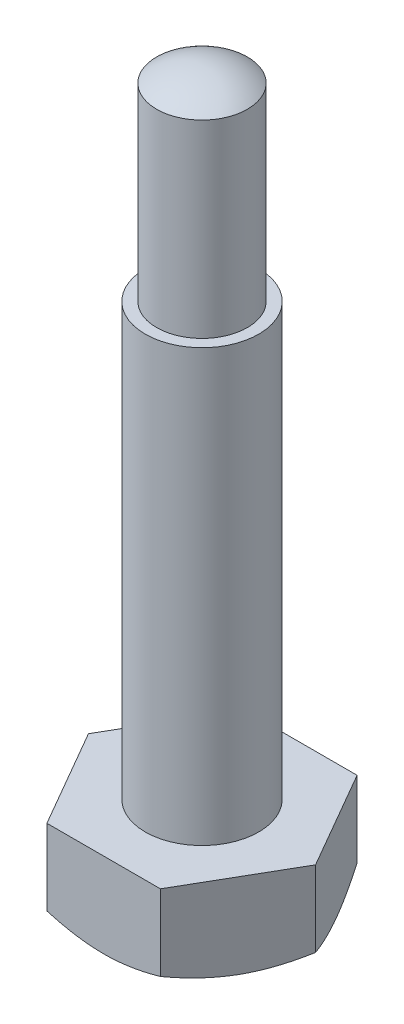
ISO-10303-21;
HEADER;
FILE_DESCRIPTION(('STEP AP214'),'2;1');
FILE_NAME('part.step','',(''),(''),'','','');
FILE_SCHEMA(('AUTOMOTIVE_DESIGN { 1 0 10303 214 1 1 1 1 }'));
ENDSEC;
DATA;
#1=APPLICATION_CONTEXT('core data for automotive mechanical design processes');
#2=APPLICATION_PROTOCOL_DEFINITION('international standard','automotive_design',2000,#1);
#3=PRODUCT_CONTEXT('',#1,'mechanical');
#4=PRODUCT('Part','Part','',(#3));
#5=PRODUCT_RELATED_PRODUCT_CATEGORY('part','',(#4));
#6=PRODUCT_DEFINITION_FORMATION('','',#4);
#7=PRODUCT_DEFINITION_CONTEXT('part definition',#1,'design');
#8=PRODUCT_DEFINITION('design','',#6,#7);
#9=PRODUCT_DEFINITION_SHAPE('','',#8);
#10=(LENGTH_UNIT() NAMED_UNIT(*) SI_UNIT(.MILLI.,.METRE.));
#11=(NAMED_UNIT(*) PLANE_ANGLE_UNIT() SI_UNIT($,.RADIAN.));
#12=(NAMED_UNIT(*) SI_UNIT($,.STERADIAN.) SOLID_ANGLE_UNIT());
#13=UNCERTAINTY_MEASURE_WITH_UNIT(LENGTH_MEASURE(1.E-05),#10,'distance_accuracy_value','');
#14=(GEOMETRIC_REPRESENTATION_CONTEXT(3) GLOBAL_UNCERTAINTY_ASSIGNED_CONTEXT((#13)) GLOBAL_UNIT_ASSIGNED_CONTEXT((#10,
#11,#12)) REPRESENTATION_CONTEXT('',''));
#15=CARTESIAN_POINT('',(0.,0.,0.));
#16=DIRECTION('',(0.,0.,1.));
#17=DIRECTION('',(1.,0.,0.));
#18=AXIS2_PLACEMENT_3D('',#15,#16,#17);
#19=CARTESIAN_POINT('',(0.,11.2,13.));
#20=DIRECTION('',(0.,0.,-1.));
#21=DIRECTION('',(-1.,0.,0.));
#22=AXIS2_PLACEMENT_3D('',#19,#20,#21);
#23=PLANE('',#22);
#24=CARTESIAN_POINT('',(26.2346972319166,9.3986800812125,13.));
#25=CARTESIAN_POINT('',(25.6258317751008,9.08374247217802,13.));
#26=CARTESIAN_POINT('',(25.0161104735973,8.77044554144086,13.));
#27=CARTESIAN_POINT('',(23.7945436675936,8.14795292384969,13.));
#28=CARTESIAN_POINT('',(23.1826980665779,7.83875742650056,13.));
#29=CARTESIAN_POINT('',(21.9555651962096,7.22483596554835,13.));
#30=CARTESIAN_POINT('',(21.3402740355332,6.92011776710691,13.));
#31=CARTESIAN_POINT('',(20.1067074220938,6.31679741810659,13.));
#32=CARTESIAN_POINT('',(19.4884320149866,6.01819517434446,13.));
#33=CARTESIAN_POINT('',(18.2148837083458,5.41270761526849,13.));
#34=CARTESIAN_POINT('',(17.559410879885,5.10624174421809,13.));
#35=CARTESIAN_POINT('',(16.2435075153828,4.50403283212745,13.));
#36=CARTESIAN_POINT('',(15.5830767817866,4.20829022113787,13.));
#37=CARTESIAN_POINT('',(14.2565046947777,3.63084437411776,13.));
#38=CARTESIAN_POINT('',(13.5903665939662,3.34913369373708,13.));
#39=CARTESIAN_POINT('',(12.2506953180829,2.80388367527136,13.));
#40=CARTESIAN_POINT('',(11.5771628598503,2.5403425934721,13.));
#41=CARTESIAN_POINT('',(10.5102407868527,2.14460554030767,13.));
#42=CARTESIAN_POINT('',(10.1198526207187,2.0043185803092,13.));
#43=CARTESIAN_POINT('',(9.335837761596,1.73312003778232,13.));
#44=CARTESIAN_POINT('',(8.94221121750567,1.60220802685639,13.));
#45=CARTESIAN_POINT('',(8.15136984112346,1.3513773216687,13.));
#46=CARTESIAN_POINT('',(7.7541543211264,1.23146078558955,13.));
#47=CARTESIAN_POINT('',(6.95602668561908,1.00455202576347,13.));
#48=CARTESIAN_POINT('',(6.55511457633311,0.897559780258935,13.));
#49=CARTESIAN_POINT('',(5.757501835472,0.700572312445905,13.));
#50=CARTESIAN_POINT('',(5.36087424149042,0.610283315624179,13.));
#51=CARTESIAN_POINT('',(4.56421970104771,0.446253048818399,13.));
#52=CARTESIAN_POINT('',(4.16419305539797,0.372510330020234,13.));
#53=CARTESIAN_POINT('',(3.36130815701185,0.243636304753637,13.));
#54=CARTESIAN_POINT('',(2.95845125293895,0.188496676239387,13.));
#55=CARTESIAN_POINT('',(2.15045576393463,0.0985545026967101,13.));
#56=CARTESIAN_POINT('',(1.74531721184881,0.0637516656603306,13.));
#57=CARTESIAN_POINT('',(0.927649753434319,0.0153668402761572,13.));
#58=CARTESIAN_POINT('',(0.515101254063948,0.0021114902553064,13.));
#59=CARTESIAN_POINT('',(-0.310099847625245,-0.00164489216117036,13.));
#60=CARTESIAN_POINT('',(-0.722752449914187,0.00785406891976774,13.));
#61=CARTESIAN_POINT('',(-1.54701663958637,0.0492378028315964,13.));
#62=CARTESIAN_POINT('',(-1.9586279623965,0.0811277840378777,13.));
#63=CARTESIAN_POINT('',(-2.77964125800397,0.166109329909629,13.));
#64=CARTESIAN_POINT('',(-3.18904317446393,0.219201432640728,13.));
#65=CARTESIAN_POINT('',(-4.01323522457472,0.346091941955446,13.));
#66=CARTESIAN_POINT('',(-4.4279625577467,0.420294471389162,13.));
#67=CARTESIAN_POINT('',(-5.25380371535489,0.586677879290008,13.));
#68=CARTESIAN_POINT('',(-5.66491717954556,0.678860529319952,13.));
#69=CARTESIAN_POINT('',(-6.48338602274355,0.878891520601452,13.));
#70=CARTESIAN_POINT('',(-6.89074051884319,0.986743447419311,13.));
#71=CARTESIAN_POINT('',(-7.70163246468095,1.2158780795427,13.));
#72=CARTESIAN_POINT('',(-8.10516989805223,1.33716084240877,13.));
#73=CARTESIAN_POINT('',(-8.90486242037007,1.58997054995961,13.));
#74=CARTESIAN_POINT('',(-9.30105125828483,1.72139129082436,13.));
#75=CARTESIAN_POINT('',(-10.0901480541392,1.99376322336739,13.));
#76=CARTESIAN_POINT('',(-10.4830558479608,2.13471488861274,13.));
#77=CARTESIAN_POINT('',(-11.2659590148391,2.42473122485754,13.));
#78=CARTESIAN_POINT('',(-11.6559536940584,2.57379776270564,13.));
#79=CARTESIAN_POINT('',(-12.4332352931876,2.8787950184023,13.));
#80=CARTESIAN_POINT('',(-12.8205222554015,3.03472562873117,13.));
#81=CARTESIAN_POINT('',(-13.5931545914344,3.35262778753084,13.));
#82=CARTESIAN_POINT('',(-13.9784970318592,3.51460645074058,13.));
#83=CARTESIAN_POINT('',(-14.7470362381397,3.84358293063094,13.));
#84=CARTESIAN_POINT('',(-15.130232967498,4.01058083238058,13.));
#85=CARTESIAN_POINT('',(-16.2768659575779,4.5179584348421,13.));
#86=CARTESIAN_POINT('',(-17.0374580657907,4.86476905141585,13.));
#87=CARTESIAN_POINT('',(-18.5077490092345,5.55023237852385,13.));
#88=CARTESIAN_POINT('',(-19.2177925562664,5.88815043389156,13.));
#89=CARTESIAN_POINT('',(-20.6336549677888,6.57277604213723,13.));
#90=CARTESIAN_POINT('',(-21.3394736760142,6.91948391767369,13.));
#91=CARTESIAN_POINT('',(-22.7451336195832,7.61853539897665,13.));
#92=CARTESIAN_POINT('',(-23.4449872328768,7.9708541637839,13.));
#93=CARTESIAN_POINT('',(-24.4926435776391,8.50342609438738,13.));
#94=CARTESIAN_POINT('',(-24.8414932478439,8.68162454333535,13.));
#95=CARTESIAN_POINT('',(-25.5385562813888,9.03925785937535,13.));
#96=CARTESIAN_POINT('',(-25.8867696476852,9.21869272070419,13.));
#97=CARTESIAN_POINT('',(-26.2346972319166,9.3986800812125,13.));
#98=B_SPLINE_CURVE_WITH_KNOTS('',3,(#24,#25,#26,#27,#28,#29,#30,#31,#32,#33,#34,#35,#36,#37,#38,
#39,#40,#41,#42,#43,#44,#45,#46,#47,#48,#49,#50,#51,#52,#53,#54,#55,#56,#57,#58,#59,#60,#61,#62,
#63,#64,#65,#66,#67,#68,#69,#70,#71,#72,#73,#74,#75,#76,#77,#78,#79,#80,#81,#82,#83,#84,#85,#86,
#87,#88,#89,#90,#91,#92,#93,#94,#95,#96,#97),.UNSPECIFIED.,.F.,.F.,(4,2,2,2,2,2,2,2,2,2,2,2,2,2,
2,2,2,2,2,2,2,2,2,2,2,2,2,2,2,2,2,2,2,2,2,2,4),(0.,2.05649083191151,4.11307635438399,
6.17288536924348,8.23266297053192,10.4033245771713,12.574073140971,14.7436575174168,
16.9130333908285,18.1574262247546,19.4017621585928,20.6463418091581,21.8909193644867,
23.1109343483001,24.3308424642549,25.5502041315244,26.7695482900314,28.0072097164768,
29.244870788097,30.4828198474871,31.7208003254393,32.9842900972413,34.2479044223365,
35.5118083542855,36.7757177031579,38.0278278991929,39.2800003551384,40.5324621042519,
41.7849042416221,43.0388692437525,44.2928555108206,46.8004608372656,49.1594516715557,
51.5185292259009,53.8690969916694,55.0442788403431,56.2194552149303),.UNSPECIFIED.);
#99=CARTESIAN_POINT('',(7.50555349946513,1.16111316720153,13.));
#100=VERTEX_POINT('',#99);
#101=CARTESIAN_POINT('',(0.,0.,13.));
#102=VERTEX_POINT('',#101);
#103=EDGE_CURVE('E319',#100,#102,#98,.T.);
#104=ORIENTED_EDGE('',*,*,#103,.F.);
#105=DIRECTION('',(0.,-1.,0.));
#106=VECTOR('',#105,1.);
#107=CARTESIAN_POINT('',(7.50555349946513,11.2,13.));
#108=LINE('',#107,#106);
#109=CARTESIAN_POINT('',(7.50555349946513,11.2,13.));
#110=VERTEX_POINT('',#109);
#111=EDGE_CURVE('E260',#110,#100,#108,.T.);
#112=ORIENTED_EDGE('',*,*,#111,.F.);
#113=DIRECTION('',(1.,0.,0.));
#114=VECTOR('',#113,1.);
#115=CARTESIAN_POINT('',(0.,11.2,13.));
#116=LINE('',#115,#114);
#117=CARTESIAN_POINT('',(-7.50555349946514,11.2,13.));
#118=VERTEX_POINT('',#117);
#119=EDGE_CURVE('E290',#118,#110,#116,.T.);
#120=ORIENTED_EDGE('',*,*,#119,.F.);
#121=DIRECTION('',(0.,-1.,0.));
#122=VECTOR('',#121,1.);
#123=CARTESIAN_POINT('',(-7.50555349946514,11.2,13.));
#124=LINE('',#123,#122);
#125=CARTESIAN_POINT('',(-7.50555349946514,1.16111316720153,13.));
#126=VERTEX_POINT('',#125);
#127=EDGE_CURVE('E272',#118,#126,#124,.T.);
#128=ORIENTED_EDGE('',*,*,#127,.T.);
#129=EDGE_CURVE('E196',#102,#126,#98,.T.);
#130=ORIENTED_EDGE('',*,*,#129,.F.);
#131=EDGE_LOOP('',(#104,#112,#120,#128,#130));
#132=FACE_BOUND('',#131,.T.);
#133=ADVANCED_FACE('F67',(#132),#23,.F.);
#134=CARTESIAN_POINT('',(11.2583302491977,11.2,6.5));
#135=DIRECTION('',(-0.866025403784439,0.,-0.5));
#136=DIRECTION('',(-0.5,0.,0.866025403784439));
#137=AXIS2_PLACEMENT_3D('',#134,#135,#136);
#138=PLANE('',#137);
#139=CARTESIAN_POINT('',(15.0112224689841,1.16117983463742,-0.000200000000004337));
#140=CARTESIAN_POINT('',(14.8462532234622,1.06594073922636,0.28553511493024));
#141=CARTESIAN_POINT('',(14.6806405091528,0.975023388768643,0.572384750493533));
#142=CARTESIAN_POINT('',(14.3480870597607,0.803033479193874,1.14838422107288));
#143=CARTESIAN_POINT('',(14.1811459070207,0.721964158005886,1.43753477949267));
#144=CARTESIAN_POINT('',(13.8456129426453,0.570760039914846,2.01869492140517));
#145=CARTESIAN_POINT('',(13.677018194831,0.500651114596917,2.31070959050873));
#146=CARTESIAN_POINT('',(13.3386571650651,0.372873231406378,2.89676808536455));
#147=CARTESIAN_POINT('',(13.1688909505188,0.315203563847,3.19081179436736));
#148=CARTESIAN_POINT('',(12.8325370588066,0.214757089290658,3.77339382413656));
#149=CARTESIAN_POINT('',(12.6659743531007,0.171647823691187,4.0618888930652));
#150=CARTESIAN_POINT('',(12.3320857121334,0.0993629979137938,4.6402009832907));
#151=CARTESIAN_POINT('',(12.164759762244,0.0701877059299412,4.93001802992393));
#152=CARTESIAN_POINT('',(11.829826771922,0.0265074870306271,5.51013898629262));
#153=CARTESIAN_POINT('',(11.6622203037118,0.0119851270560766,5.80044190490974));
#154=CARTESIAN_POINT('',(11.3268526424848,-0.00207691304846538,6.38131573337049));
#155=CARTESIAN_POINT('',(11.1590914544088,-0.00161705611710478,6.67188663465624));
#156=CARTESIAN_POINT('',(10.8454621582709,0.0132389071962976,7.21510851030914));
#157=CARTESIAN_POINT('',(10.6995717015937,0.0258229433100638,7.46779819361344));
#158=CARTESIAN_POINT('',(10.4081263689782,0.0620843798054116,7.97259631733243));
#159=CARTESIAN_POINT('',(10.2625715175088,0.085762564867195,8.22470471536558));
#160=CARTESIAN_POINT('',(9.97187645625749,0.143799449915545,8.72820333096215));
#161=CARTESIAN_POINT('',(9.82673668922661,0.178166971252932,8.97959278165833));
#162=CARTESIAN_POINT('',(9.5371376012129,0.256979550610595,9.48119311592368));
#163=CARTESIAN_POINT('',(9.39267832717071,0.301425293732573,9.73140391818929));
#164=CARTESIAN_POINT('',(8.9541641315381,0.451003390781539,10.4909327848652));
#165=CARTESIAN_POINT('',(8.66137908356622,0.571050318482427,10.9980513636489));
#166=CARTESIAN_POINT('',(8.08017480212894,0.843507833939792,12.0047267086749));
#167=CARTESIAN_POINT('',(7.79174812714238,0.995854432961327,12.5042963640098));
#168=CARTESIAN_POINT('',(7.50543802941129,1.16117983463742,13.0002));
#169=B_SPLINE_CURVE_WITH_KNOTS('',3,(#139,#140,#141,#142,#143,#144,#145,#146,#147,#148,#149,
#150,#151,#152,#153,#154,#155,#156,#157,#158,#159,#160,#161,#162,#163,#164,#165,#166,#167,#168),
.UNSPECIFIED.,.F.,.F.,(4,2,2,2,2,2,2,2,2,2,2,2,2,2,4),(0.,1.03025461984708,2.0608470650412,
3.09383660213902,4.12676718933493,5.13420251692741,6.14165723434359,7.14791193250861,
8.15413553822912,9.03008081731204,9.90608806065233,10.7828201537635,11.6596118636232,
13.4517531627236,15.240376691212),.UNSPECIFIED.);
#170=CARTESIAN_POINT('',(15.0111069989303,1.16111316720152,0.));
#171=VERTEX_POINT('',#170);
#172=CARTESIAN_POINT('',(11.2583302491977,0.,6.5));
#173=VERTEX_POINT('',#172);
#174=EDGE_CURVE('E181',#171,#173,#169,.T.);
#175=ORIENTED_EDGE('',*,*,#174,.F.);
#176=DIRECTION('',(0.,-1.,0.));
#177=VECTOR('',#176,1.);
#178=CARTESIAN_POINT('',(15.0111069989303,11.2,0.));
#179=LINE('',#178,#177);
#180=CARTESIAN_POINT('',(15.0111069989303,11.2,0.));
#181=VERTEX_POINT('',#180);
#182=EDGE_CURVE('E253',#181,#171,#179,.T.);
#183=ORIENTED_EDGE('',*,*,#182,.F.);
#184=DIRECTION('',(0.5,0.,-0.866025403784439));
#185=VECTOR('',#184,1.);
#186=CARTESIAN_POINT('',(11.2583302491977,11.2,6.5));
#187=LINE('',#186,#185);
#188=EDGE_CURVE('E287',#110,#181,#187,.T.);
#189=ORIENTED_EDGE('',*,*,#188,.F.);
#190=ORIENTED_EDGE('',*,*,#111,.T.);
#191=EDGE_CURVE('E172',#173,#100,#169,.T.);
#192=ORIENTED_EDGE('',*,*,#191,.F.);
#193=EDGE_LOOP('',(#175,#183,#189,#190,#192));
#194=FACE_BOUND('',#193,.T.);
#195=ADVANCED_FACE('F239',(#194),#138,.F.);
#196=CARTESIAN_POINT('',(11.2583302491977,11.2,-6.5));
#197=DIRECTION('',(-0.866025403784439,0.,0.5));
#198=DIRECTION('',(0.5,0.,0.866025403784439));
#199=AXIS2_PLACEMENT_3D('',#196,#197,#198);
#200=PLANE('',#199);
#201=CARTESIAN_POINT('',(7.50543802941129,1.16117983463742,-13.0002));
#202=CARTESIAN_POINT('',(7.67040727493319,1.06594073922636,-12.7144648850698));
#203=CARTESIAN_POINT('',(7.83601998924261,0.975023388768648,-12.4276152495065));
#204=CARTESIAN_POINT('',(8.16857343863467,0.803033479193879,-11.8516157789271));
#205=CARTESIAN_POINT('',(8.33551459137467,0.72196415800589,-11.5624652205073));
#206=CARTESIAN_POINT('',(8.67104755575013,0.57076003991485,-10.9813050785948));
#207=CARTESIAN_POINT('',(8.83964230356439,0.50065111459692,-10.6892904094913));
#208=CARTESIAN_POINT('',(9.17800333333027,0.372873231406381,-10.1032319146355));
#209=CARTESIAN_POINT('',(9.34776954787656,0.315203563847003,-9.80918820563265));
#210=CARTESIAN_POINT('',(9.68412343958884,0.21475708929066,-9.22660617586344));
#211=CARTESIAN_POINT('',(9.85068614529467,0.171647823691188,-8.93811110693481));
#212=CARTESIAN_POINT('',(10.184574786262,0.0993629979137942,-8.35979901670931));
#213=CARTESIAN_POINT('',(10.3519007361514,0.0701877059299421,-8.06998197007607));
#214=CARTESIAN_POINT('',(10.6868337264734,0.0265074870306285,-7.48986101370739));
#215=CARTESIAN_POINT('',(10.8544401946836,0.0119851270560779,-7.19955809509027));
#216=CARTESIAN_POINT('',(11.1898078559106,-0.00207691304846485,-6.61868426662952));
#217=CARTESIAN_POINT('',(11.3575690439866,-0.00161705611710504,-6.32811336534377));
#218=CARTESIAN_POINT('',(11.6711983401245,0.0132389071962962,-5.78489148969087));
#219=CARTESIAN_POINT('',(11.8170887968016,0.025822943310062,-5.53220180638657));
#220=CARTESIAN_POINT('',(12.1085341294172,0.0620843798054099,-5.02740368266758));
#221=CARTESIAN_POINT('',(12.2540889808866,0.0857625648671939,-4.77529528463443));
#222=CARTESIAN_POINT('',(12.5447840421379,0.143799449915544,-4.27179666903786));
#223=CARTESIAN_POINT('',(12.6899238091688,0.17816697125293,-4.02040721834168));
#224=CARTESIAN_POINT('',(12.9795228971825,0.256979550610593,-3.51880688407633));
#225=CARTESIAN_POINT('',(13.1239821712247,0.301425293732571,-3.26859608181072));
#226=CARTESIAN_POINT('',(13.5624963668573,0.451003390781537,-2.50906721513485));
#227=CARTESIAN_POINT('',(13.8552814148292,0.571050318482424,-2.00194863635106));
#228=CARTESIAN_POINT('',(14.4364856962665,0.843507833939786,-0.995273291325125));
#229=CARTESIAN_POINT('',(14.724912371253,0.995854432961321,-0.495703635990249));
#230=CARTESIAN_POINT('',(15.0112224689841,1.16117983463741,0.000199999999994435));
#231=B_SPLINE_CURVE_WITH_KNOTS('',3,(#201,#202,#203,#204,#205,#206,#207,#208,#209,#210,#211,
#212,#213,#214,#215,#216,#217,#218,#219,#220,#221,#222,#223,#224,#225,#226,#227,#228,#229,#230),
.UNSPECIFIED.,.F.,.F.,(4,2,2,2,2,2,2,2,2,2,2,2,2,2,4),(0.,1.03025461984709,2.0608470650412,
3.09383660213902,4.12676718933493,5.13420251692742,6.14165723434359,7.14791193250861,
8.15413553822912,9.03008081731204,9.90608806065234,10.7828201537635,11.6596118636232,
13.4517531627236,15.240376691212),.UNSPECIFIED.);
#232=CARTESIAN_POINT('',(7.50555349946515,1.16111316720151,-13.));
#233=VERTEX_POINT('',#232);
#234=CARTESIAN_POINT('',(11.2583302491977,0.,-6.5));
#235=VERTEX_POINT('',#234);
#236=EDGE_CURVE('E151',#233,#235,#231,.T.);
#237=ORIENTED_EDGE('',*,*,#236,.F.);
#238=DIRECTION('',(0.,-1.,0.));
#239=VECTOR('',#238,1.);
#240=CARTESIAN_POINT('',(7.50555349946513,11.2,-13.));
#241=LINE('',#240,#239);
#242=CARTESIAN_POINT('',(7.50555349946513,11.2,-13.));
#243=VERTEX_POINT('',#242);
#244=EDGE_CURVE('E178',#243,#233,#241,.T.);
#245=ORIENTED_EDGE('',*,*,#244,.F.);
#246=DIRECTION('',(-0.5,0.,-0.866025403784439));
#247=VECTOR('',#246,1.);
#248=CARTESIAN_POINT('',(11.2583302491977,11.2,-6.5));
#249=LINE('',#248,#247);
#250=EDGE_CURVE('E258',#181,#243,#249,.T.);
#251=ORIENTED_EDGE('',*,*,#250,.F.);
#252=ORIENTED_EDGE('',*,*,#182,.T.);
#253=EDGE_CURVE('E180',#235,#171,#231,.T.);
#254=ORIENTED_EDGE('',*,*,#253,.F.);
#255=EDGE_LOOP('',(#237,#245,#251,#252,#254));
#256=FACE_BOUND('',#255,.T.);
#257=ADVANCED_FACE('F236',(#256),#200,.F.);
#258=CARTESIAN_POINT('',(0.,11.2,-13.));
#259=DIRECTION('',(0.,0.,1.));
#260=DIRECTION('',(1.,0.,0.));
#261=AXIS2_PLACEMENT_3D('',#258,#259,#260);
#262=PLANE('',#261);
#263=CARTESIAN_POINT('',(-26.2346972319166,9.3986800812125,-13.));
#264=CARTESIAN_POINT('',(-25.6258317751009,9.08374247217802,-13.));
#265=CARTESIAN_POINT('',(-25.0161104735973,8.77044554144086,-13.));
#266=CARTESIAN_POINT('',(-23.7945436675936,8.14795292384969,-13.));
#267=CARTESIAN_POINT('',(-23.1826980665779,7.83875742650056,-13.));
#268=CARTESIAN_POINT('',(-21.9555651962096,7.22483596554835,-13.));
#269=CARTESIAN_POINT('',(-21.3402740355332,6.92011776710691,-13.));
#270=CARTESIAN_POINT('',(-20.1067074220938,6.31679741810659,-13.));
#271=CARTESIAN_POINT('',(-19.4884320149866,6.01819517434446,-13.));
#272=CARTESIAN_POINT('',(-18.2148837083458,5.41270761526849,-13.));
#273=CARTESIAN_POINT('',(-17.559410879885,5.10624174421809,-13.));
#274=CARTESIAN_POINT('',(-16.2435075153828,4.50403283212746,-13.));
#275=CARTESIAN_POINT('',(-15.5830767817866,4.20829022113787,-13.));
#276=CARTESIAN_POINT('',(-14.2565046947778,3.63084437411777,-13.));
#277=CARTESIAN_POINT('',(-13.5903665939662,3.34913369373708,-13.));
#278=CARTESIAN_POINT('',(-12.2506953180829,2.80388367527137,-13.));
#279=CARTESIAN_POINT('',(-11.5771628598503,2.5403425934721,-13.));
#280=CARTESIAN_POINT('',(-10.5102407868527,2.14460554030768,-13.));
#281=CARTESIAN_POINT('',(-10.1198526207187,2.0043185803092,-13.));
#282=CARTESIAN_POINT('',(-9.33583776159601,1.73312003778233,-13.));
#283=CARTESIAN_POINT('',(-8.94221121750568,1.6022080268564,-13.));
#284=CARTESIAN_POINT('',(-8.15136984112347,1.3513773216687,-13.));
#285=CARTESIAN_POINT('',(-7.75415432112642,1.23146078558956,-13.));
#286=CARTESIAN_POINT('',(-6.95602668561909,1.00455202576348,-13.));
#287=CARTESIAN_POINT('',(-6.55511457633312,0.897559780258941,-13.));
#288=CARTESIAN_POINT('',(-5.75750183547201,0.70057231244591,-13.));
#289=CARTESIAN_POINT('',(-5.36087424149043,0.610283315624184,-13.));
#290=CARTESIAN_POINT('',(-4.56421970104772,0.446253048818404,-13.));
#291=CARTESIAN_POINT('',(-4.16419305539798,0.37251033002024,-13.));
#292=CARTESIAN_POINT('',(-3.36130815701186,0.243636304753643,-13.));
#293=CARTESIAN_POINT('',(-2.95845125293896,0.188496676239394,-13.));
#294=CARTESIAN_POINT('',(-2.15045576393464,0.0985545026967153,-13.));
#295=CARTESIAN_POINT('',(-1.74531721184882,0.0637516656603348,-13.));
#296=CARTESIAN_POINT('',(-0.927649753434329,0.0153668402761607,-13.));
#297=CARTESIAN_POINT('',(-0.515101254063958,0.00211149025531042,-13.));
#298=CARTESIAN_POINT('',(0.310099847625235,-0.0016448921611664,-13.));
#299=CARTESIAN_POINT('',(0.722752449914178,0.00785406891977111,-13.));
#300=CARTESIAN_POINT('',(1.54701663958636,0.0492378028315994,-13.));
#301=CARTESIAN_POINT('',(1.95862796239649,0.0811277840378808,-13.));
#302=CARTESIAN_POINT('',(2.77964125800396,0.166109329909633,-13.));
#303=CARTESIAN_POINT('',(3.18904317446392,0.219201432640732,-13.));
#304=CARTESIAN_POINT('',(4.01323522457471,0.346091941955449,-13.));
#305=CARTESIAN_POINT('',(4.42796255774669,0.420294471389165,-13.));
#306=CARTESIAN_POINT('',(5.25380371535488,0.58667787929001,-13.));
#307=CARTESIAN_POINT('',(5.66491717954554,0.678860529319955,-13.));
#308=CARTESIAN_POINT('',(6.48338602274354,0.878891520601454,-13.));
#309=CARTESIAN_POINT('',(6.89074051884318,0.986743447419312,-13.));
#310=CARTESIAN_POINT('',(7.70163246468094,1.2158780795427,-13.));
#311=CARTESIAN_POINT('',(8.10516989805222,1.33716084240877,-13.));
#312=CARTESIAN_POINT('',(8.90486242037005,1.58997054995961,-13.));
#313=CARTESIAN_POINT('',(9.30105125828482,1.72139129082436,-13.));
#314=CARTESIAN_POINT('',(10.0901480541392,1.99376322336739,-13.));
#315=CARTESIAN_POINT('',(10.4830558479608,2.13471488861274,-13.));
#316=CARTESIAN_POINT('',(11.265959014839,2.42473122485754,-13.));
#317=CARTESIAN_POINT('',(11.6559536940584,2.57379776270564,-13.));
#318=CARTESIAN_POINT('',(12.4332352931876,2.87879501840231,-13.));
#319=CARTESIAN_POINT('',(12.8205222554015,3.03472562873117,-13.));
#320=CARTESIAN_POINT('',(13.5931545914344,3.35262778753084,-13.));
#321=CARTESIAN_POINT('',(13.9784970318592,3.51460645074058,-13.));
#322=CARTESIAN_POINT('',(14.7470362381397,3.84358293063094,-13.));
#323=CARTESIAN_POINT('',(15.1302329674979,4.01058083238057,-13.));
#324=CARTESIAN_POINT('',(16.2768659575778,4.51795843484209,-13.));
#325=CARTESIAN_POINT('',(17.0374580657907,4.86476905141584,-13.));
#326=CARTESIAN_POINT('',(18.5077490092345,5.55023237852385,-13.));
#327=CARTESIAN_POINT('',(19.2177925562664,5.88815043389156,-13.));
#328=CARTESIAN_POINT('',(20.6336549677888,6.57277604213723,-13.));
#329=CARTESIAN_POINT('',(21.3394736760142,6.91948391767369,-13.));
#330=CARTESIAN_POINT('',(22.7451336195832,7.61853539897665,-13.));
#331=CARTESIAN_POINT('',(23.4449872328768,7.9708541637839,-13.));
#332=CARTESIAN_POINT('',(24.4926435776391,8.50342609438737,-13.));
#333=CARTESIAN_POINT('',(24.8414932478439,8.68162454333534,-13.));
#334=CARTESIAN_POINT('',(25.5385562813888,9.03925785937535,-13.));
#335=CARTESIAN_POINT('',(25.8867696476852,9.21869272070418,-13.));
#336=CARTESIAN_POINT('',(26.2346972319166,9.39868008121249,-13.));
#337=B_SPLINE_CURVE_WITH_KNOTS('',3,(#263,#264,#265,#266,#267,#268,#269,#270,#271,#272,#273,
#274,#275,#276,#277,#278,#279,#280,#281,#282,#283,#284,#285,#286,#287,#288,#289,#290,#291,#292,
#293,#294,#295,#296,#297,#298,#299,#300,#301,#302,#303,#304,#305,#306,#307,#308,#309,#310,#311,
#312,#313,#314,#315,#316,#317,#318,#319,#320,#321,#322,#323,#324,#325,#326,#327,#328,#329,#330,
#331,#332,#333,#334,#335,#336),.UNSPECIFIED.,.F.,.F.,(4,2,2,2,2,2,2,2,2,2,2,2,2,2,2,2,2,2,2,2,2,
2,2,2,2,2,2,2,2,2,2,2,2,2,2,2,4),(0.,2.05649083191151,4.11307635438399,6.17288536924349,
8.23266297053193,10.4033245771713,12.574073140971,14.7436575174168,16.9130333908285,
18.1574262247546,19.4017621585928,20.6463418091581,21.8909193644867,23.1109343483001,
24.3308424642549,25.5502041315244,26.7695482900314,28.0072097164768,29.244870788097,
30.4828198474871,31.7208003254393,32.9842900972413,34.2479044223365,35.5118083542855,
36.7757177031579,38.0278278991929,39.2800003551383,40.5324621042519,41.7849042416221,
43.0388692437525,44.2928555108206,46.8004608372656,49.1594516715557,51.5185292259009,
53.8690969916694,55.044278840343,56.2194552149302),.UNSPECIFIED.);
#338=CARTESIAN_POINT('',(-7.50555349946514,1.16111316720153,-13.));
#339=VERTEX_POINT('',#338);
#340=CARTESIAN_POINT('',(0.,0.,-13.));
#341=VERTEX_POINT('',#340);
#342=EDGE_CURVE('E163',#339,#341,#337,.T.);
#343=ORIENTED_EDGE('',*,*,#342,.F.);
#344=DIRECTION('',(0.,-1.,0.));
#345=VECTOR('',#344,1.);
#346=CARTESIAN_POINT('',(-7.50555349946514,11.2,-13.));
#347=LINE('',#346,#345);
#348=CARTESIAN_POINT('',(-7.50555349946514,11.2,-13.));
#349=VERTEX_POINT('',#348);
#350=EDGE_CURVE('E264',#349,#339,#347,.T.);
#351=ORIENTED_EDGE('',*,*,#350,.F.);
#352=DIRECTION('',(-1.,0.,0.));
#353=VECTOR('',#352,1.);
#354=CARTESIAN_POINT('',(0.,11.2,-13.));
#355=LINE('',#354,#353);
#356=EDGE_CURVE('E282',#243,#349,#355,.T.);
#357=ORIENTED_EDGE('',*,*,#356,.F.);
#358=ORIENTED_EDGE('',*,*,#244,.T.);
#359=EDGE_CURVE('E149',#341,#233,#337,.T.);
#360=ORIENTED_EDGE('',*,*,#359,.F.);
#361=EDGE_LOOP('',(#343,#351,#357,#358,#360));
#362=FACE_BOUND('',#361,.T.);
#363=ADVANCED_FACE('F175',(#362),#262,.F.);
#364=CARTESIAN_POINT('',(-11.2583302491977,11.2,-6.5));
#365=DIRECTION('',(0.866025403784439,0.,0.5));
#366=DIRECTION('',(0.5,0.,-0.866025403784439));
#367=AXIS2_PLACEMENT_3D('',#364,#365,#366);
#368=PLANE('',#367);
#369=CARTESIAN_POINT('',(-15.0112224689841,1.16117983463742,0.00019999999999674));
#370=CARTESIAN_POINT('',(-14.8462532234622,1.06594073922636,-0.285535114930248));
#371=CARTESIAN_POINT('',(-14.6806405091528,0.975023388768647,-0.572384750493542));
#372=CARTESIAN_POINT('',(-14.3480870597607,0.803033479193878,-1.14838422107289));
#373=CARTESIAN_POINT('',(-14.1811459070207,0.72196415800589,-1.43753477949268));
#374=CARTESIAN_POINT('',(-13.8456129426453,0.57076003991485,-2.01869492140517));
#375=CARTESIAN_POINT('',(-13.677018194831,0.500651114596922,-2.31070959050874));
#376=CARTESIAN_POINT('',(-13.3386571650651,0.372873231406383,-2.89676808536456));
#377=CARTESIAN_POINT('',(-13.1688909505188,0.315203563847005,-3.19081179436737));
#378=CARTESIAN_POINT('',(-12.8325370588066,0.214757089290663,-3.77339382413657));
#379=CARTESIAN_POINT('',(-12.6659743531007,0.171647823691191,-4.06188889306521));
#380=CARTESIAN_POINT('',(-12.3320857121334,0.0993629979137987,-4.64020098329071));
#381=CARTESIAN_POINT('',(-12.164759762244,0.0701877059299458,-4.93001802992395));
#382=CARTESIAN_POINT('',(-11.829826771922,0.026507487030632,-5.51013898629263));
#383=CARTESIAN_POINT('',(-11.6622203037118,0.0119851270560818,-5.80044190490975));
#384=CARTESIAN_POINT('',(-11.3268526424848,-0.00207691304845954,-6.3813157333705));
#385=CARTESIAN_POINT('',(-11.1590914544088,-0.00161705611709881,-6.67188663465625));
#386=CARTESIAN_POINT('',(-10.8454621582709,0.0132389071963028,-7.21510851030915));
#387=CARTESIAN_POINT('',(-10.6995717015938,0.0258229433100683,-7.46779819361345));
#388=CARTESIAN_POINT('',(-10.4081263689782,0.0620843798054163,-7.97259631733244));
#389=CARTESIAN_POINT('',(-10.2625715175088,0.0857625648672006,-8.22470471536559));
#390=CARTESIAN_POINT('',(-9.97187645625749,0.143799449915551,-8.72820333096215));
#391=CARTESIAN_POINT('',(-9.82673668922662,0.178166971252938,-8.97959278165834));
#392=CARTESIAN_POINT('',(-9.53713760121291,0.256979550610601,-9.48119311592369));
#393=CARTESIAN_POINT('',(-9.39267832717071,0.301425293732579,-9.7314039181893));
#394=CARTESIAN_POINT('',(-8.95416413153811,0.451003390781546,-10.4909327848652));
#395=CARTESIAN_POINT('',(-8.66137908356623,0.571050318482433,-10.998051363649));
#396=CARTESIAN_POINT('',(-8.08017480212894,0.843507833939796,-12.0047267086749));
#397=CARTESIAN_POINT('',(-7.79174812714238,0.995854432961331,-12.5042963640098));
#398=CARTESIAN_POINT('',(-7.5054380294113,1.16117983463742,-13.0002));
#399=B_SPLINE_CURVE_WITH_KNOTS('',3,(#369,#370,#371,#372,#373,#374,#375,#376,#377,#378,#379,
#380,#381,#382,#383,#384,#385,#386,#387,#388,#389,#390,#391,#392,#393,#394,#395,#396,#397,#398),
.UNSPECIFIED.,.F.,.F.,(4,2,2,2,2,2,2,2,2,2,2,2,2,2,4),(0.,1.03025461984709,2.0608470650412,
3.09383660213902,4.12676718933493,5.13420251692742,6.14165723434359,7.14791193250861,
8.15413553822912,9.03008081731204,9.90608806065233,10.7828201537635,11.6596118636232,
13.4517531627236,15.240376691212),.UNSPECIFIED.);
#400=CARTESIAN_POINT('',(-15.0111069989303,1.16111316720153,0.));
#401=VERTEX_POINT('',#400);
#402=CARTESIAN_POINT('',(-11.2583302491977,0.,-6.5));
#403=VERTEX_POINT('',#402);
#404=EDGE_CURVE('E157',#401,#403,#399,.T.);
#405=ORIENTED_EDGE('',*,*,#404,.F.);
#406=DIRECTION('',(0.,-1.,0.));
#407=VECTOR('',#406,1.);
#408=CARTESIAN_POINT('',(-15.0111069989303,11.2,0.));
#409=LINE('',#408,#407);
#410=CARTESIAN_POINT('',(-15.0111069989303,11.2,0.));
#411=VERTEX_POINT('',#410);
#412=EDGE_CURVE('E269',#411,#401,#409,.T.);
#413=ORIENTED_EDGE('',*,*,#412,.F.);
#414=DIRECTION('',(-0.5,0.,0.866025403784439));
#415=VECTOR('',#414,1.);
#416=CARTESIAN_POINT('',(-11.2583302491977,11.2,-6.5));
#417=LINE('',#416,#415);
#418=EDGE_CURVE('E279',#349,#411,#417,.T.);
#419=ORIENTED_EDGE('',*,*,#418,.F.);
#420=ORIENTED_EDGE('',*,*,#350,.T.);
#421=EDGE_CURVE('E167',#403,#339,#399,.T.);
#422=ORIENTED_EDGE('',*,*,#421,.F.);
#423=EDGE_LOOP('',(#405,#413,#419,#420,#422));
#424=FACE_BOUND('',#423,.T.);
#425=ADVANCED_FACE('F201',(#424),#368,.F.);
#426=CARTESIAN_POINT('',(-11.2583302491977,11.2,6.5));
#427=DIRECTION('',(0.866025403784439,0.,-0.5));
#428=DIRECTION('',(-0.5,0.,-0.866025403784439));
#429=AXIS2_PLACEMENT_3D('',#426,#427,#428);
#430=PLANE('',#429);
#431=CARTESIAN_POINT('',(-7.5054380294113,1.16117983463742,13.0002));
#432=CARTESIAN_POINT('',(-7.67040727493321,1.06594073922636,12.7144648850698));
#433=CARTESIAN_POINT('',(-7.83601998924262,0.975023388768647,12.4276152495065));
#434=CARTESIAN_POINT('',(-8.16857343863469,0.803033479193878,11.8516157789271));
#435=CARTESIAN_POINT('',(-8.33551459137468,0.72196415800589,11.5624652205073));
#436=CARTESIAN_POINT('',(-8.67104755575014,0.57076003991485,10.9813050785948));
#437=CARTESIAN_POINT('',(-8.83964230356441,0.500651114596921,10.6892904094913));
#438=CARTESIAN_POINT('',(-9.17800333333028,0.372873231406382,10.1032319146354));
#439=CARTESIAN_POINT('',(-9.34776954787657,0.315203563847005,9.80918820563264));
#440=CARTESIAN_POINT('',(-9.68412343958886,0.214757089290662,9.22660617586343));
#441=CARTESIAN_POINT('',(-9.85068614529468,0.17164782369119,8.9381111069348));
#442=CARTESIAN_POINT('',(-10.184574786262,0.0993629979137964,8.3597990167093));
#443=CARTESIAN_POINT('',(-10.3519007361514,0.0701877059299439,8.06998197007606));
#444=CARTESIAN_POINT('',(-10.6868337264734,0.0265074870306307,7.48986101370738));
#445=CARTESIAN_POINT('',(-10.8544401946836,0.0119851270560809,7.19955809509026));
#446=CARTESIAN_POINT('',(-11.1898078559106,-0.00207691304846105,6.61868426662951));
#447=CARTESIAN_POINT('',(-11.3575690439866,-0.00161705611710112,6.32811336534376));
#448=CARTESIAN_POINT('',(-11.6711983401245,0.0132389071963004,5.78489148969086));
#449=CARTESIAN_POINT('',(-11.8170887968017,0.0258229433100665,5.53220180638656));
#450=CARTESIAN_POINT('',(-12.1085341294172,0.0620843798054148,5.02740368266757));
#451=CARTESIAN_POINT('',(-12.2540889808866,0.0857625648671988,4.77529528463442));
#452=CARTESIAN_POINT('',(-12.5447840421379,0.14379944991555,4.27179666903786));
#453=CARTESIAN_POINT('',(-12.6899238091688,0.178166971252936,4.02040721834167));
#454=CARTESIAN_POINT('',(-12.9795228971825,0.256979550610598,3.51880688407632));
#455=CARTESIAN_POINT('',(-13.1239821712247,0.301425293732576,3.26859608181072));
#456=CARTESIAN_POINT('',(-13.5624963668573,0.451003390781541,2.50906721513484));
#457=CARTESIAN_POINT('',(-13.8552814148292,0.571050318482429,2.00194863635105));
#458=CARTESIAN_POINT('',(-14.4364856962665,0.843507833939793,0.995273291325118));
#459=CARTESIAN_POINT('',(-14.724912371253,0.995854432961329,0.495703635990241));
#460=CARTESIAN_POINT('',(-15.0112224689841,1.16117983463742,-0.000200000000003397));
#461=B_SPLINE_CURVE_WITH_KNOTS('',3,(#431,#432,#433,#434,#435,#436,#437,#438,#439,#440,#441,
#442,#443,#444,#445,#446,#447,#448,#449,#450,#451,#452,#453,#454,#455,#456,#457,#458,#459,#460),
.UNSPECIFIED.,.F.,.F.,(4,2,2,2,2,2,2,2,2,2,2,2,2,2,4),(0.,1.03025461984708,2.0608470650412,
3.09383660213902,4.12676718933493,5.13420251692742,6.14165723434359,7.14791193250861,
8.15413553822912,9.03008081731204,9.90608806065233,10.7828201537635,11.6596118636232,
13.4517531627236,15.240376691212),.UNSPECIFIED.);
#462=CARTESIAN_POINT('',(-11.2583302491977,0.,6.5));
#463=VERTEX_POINT('',#462);
#464=EDGE_CURVE('E13',#126,#463,#461,.T.);
#465=ORIENTED_EDGE('',*,*,#464,.F.);
#466=ORIENTED_EDGE('',*,*,#127,.F.);
#467=DIRECTION('',(0.5,0.,0.866025403784439));
#468=VECTOR('',#467,1.);
#469=CARTESIAN_POINT('',(-11.2583302491977,11.2,6.5));
#470=LINE('',#469,#468);
#471=EDGE_CURVE('E276',#411,#118,#470,.T.);
#472=ORIENTED_EDGE('',*,*,#471,.F.);
#473=ORIENTED_EDGE('',*,*,#412,.T.);
#474=EDGE_CURVE('E71',#463,#401,#461,.T.);
#475=ORIENTED_EDGE('',*,*,#474,.F.);
#476=EDGE_LOOP('',(#465,#466,#472,#473,#475));
#477=FACE_BOUND('',#476,.T.);
#478=ADVANCED_FACE('F329',(#477),#430,.F.);
#479=CARTESIAN_POINT('',(0.,11.2,0.));
#480=DIRECTION('',(0.,1.,0.));
#481=DIRECTION('',(0.,0.,1.));
#482=AXIS2_PLACEMENT_3D('',#479,#480,#481);
#483=PLANE('',#482);
#484=ORIENTED_EDGE('',*,*,#119,.T.);
#485=ORIENTED_EDGE('',*,*,#188,.T.);
#486=ORIENTED_EDGE('',*,*,#250,.T.);
#487=ORIENTED_EDGE('',*,*,#356,.T.);
#488=ORIENTED_EDGE('',*,*,#418,.T.);
#489=ORIENTED_EDGE('',*,*,#471,.T.);
#490=EDGE_LOOP('',(#484,#485,#486,#487,#488,#489));
#491=FACE_BOUND('',#490,.T.);
#492=CARTESIAN_POINT('',(0.,11.2,0.));
#493=DIRECTION('',(0.,1.,0.));
#494=DIRECTION('',(0.,0.,1.));
#495=AXIS2_PLACEMENT_3D('',#492,#493,#494);
#496=CIRCLE('',#495,7.5);
#497=CARTESIAN_POINT('',(0.,11.2,7.5));
#498=VERTEX_POINT('',#497);
#499=EDGE_CURVE('E294',#498,#498,#496,.T.);
#500=ORIENTED_EDGE('',*,*,#499,.F.);
#501=EDGE_LOOP('',(#500));
#502=FACE_BOUND('',#501,.T.);
#503=ADVANCED_FACE('F332',(#491,#502),#483,.T.);
#504=CARTESIAN_POINT('',(0.,68.2,0.));
#505=DIRECTION('',(0.,-1.,0.));
#506=DIRECTION('',(0.,0.,-1.));
#507=AXIS2_PLACEMENT_3D('',#504,#505,#506);
#508=CYLINDRICAL_SURFACE('',#507,7.5);
#509=ORIENTED_EDGE('',*,*,#499,.T.);
#510=EDGE_LOOP('',(#509));
#511=FACE_BOUND('',#510,.T.);
#512=CARTESIAN_POINT('',(0.,68.2,0.));
#513=DIRECTION('',(0.,1.,0.));
#514=DIRECTION('',(0.,0.,1.));
#515=AXIS2_PLACEMENT_3D('',#512,#513,#514);
#516=CIRCLE('',#515,7.5);
#517=CARTESIAN_POINT('',(0.,68.2,7.5));
#518=VERTEX_POINT('',#517);
#519=EDGE_CURVE('E298',#518,#518,#516,.T.);
#520=ORIENTED_EDGE('',*,*,#519,.F.);
#521=EDGE_LOOP('',(#520));
#522=FACE_BOUND('',#521,.T.);
#523=ADVANCED_FACE('F350',(#511,#522),#508,.T.);
#524=CARTESIAN_POINT('',(0.,68.2,0.));
#525=DIRECTION('',(0.,1.,0.));
#526=DIRECTION('',(0.,0.,1.));
#527=AXIS2_PLACEMENT_3D('',#524,#525,#526);
#528=PLANE('',#527);
#529=CARTESIAN_POINT('',(0.,68.2,0.));
#530=DIRECTION('',(0.,1.,0.));
#531=DIRECTION('',(0.,0.,1.));
#532=AXIS2_PLACEMENT_3D('',#529,#530,#531);
#533=CIRCLE('',#532,6.);
#534=CARTESIAN_POINT('',(0.,68.2,6.));
#535=VERTEX_POINT('',#534);
#536=EDGE_CURVE('E302',#535,#535,#533,.T.);
#537=ORIENTED_EDGE('',*,*,#536,.F.);
#538=EDGE_LOOP('',(#537));
#539=FACE_BOUND('',#538,.T.);
#540=ORIENTED_EDGE('',*,*,#519,.T.);
#541=EDGE_LOOP('',(#540));
#542=FACE_BOUND('',#541,.T.);
#543=ADVANCED_FACE('F345',(#539,#542),#528,.T.);
#544=CARTESIAN_POINT('',(0.,93.2,0.));
#545=DIRECTION('',(0.,-1.,0.));
#546=DIRECTION('',(0.,0.,-1.));
#547=AXIS2_PLACEMENT_3D('',#544,#545,#546);
#548=CYLINDRICAL_SURFACE('',#547,6.);
#549=ORIENTED_EDGE('',*,*,#536,.T.);
#550=EDGE_LOOP('',(#549));
#551=FACE_BOUND('',#550,.T.);
#552=CARTESIAN_POINT('',(0.,93.2,0.));
#553=DIRECTION('',(0.,1.,0.));
#554=DIRECTION('',(0.,0.,1.));
#555=AXIS2_PLACEMENT_3D('',#552,#553,#554);
#556=CIRCLE('',#555,6.);
#557=CARTESIAN_POINT('',(0.,93.2,6.));
#558=VERTEX_POINT('',#557);
#559=EDGE_CURVE('E305',#558,#558,#556,.T.);
#560=ORIENTED_EDGE('',*,*,#559,.F.);
#561=EDGE_LOOP('',(#560));
#562=FACE_BOUND('',#561,.T.);
#563=ADVANCED_FACE('F211',(#551,#562),#548,.T.);
#564=CARTESIAN_POINT('',(0.,0.,0.));
#565=DIRECTION('',(0.,1.,0.));
#566=DIRECTION('',(0.,0.,-1.));
#567=AXIS2_PLACEMENT_3D('',#564,#565,#566);
#568=CONICAL_SURFACE('',#567,13.,1.0471975511966);
#569=ORIENTED_EDGE('',*,*,#404,.T.);
#570=CARTESIAN_POINT('',(0.,0.,0.));
#571=DIRECTION('',(0.,-1.,0.));
#572=DIRECTION('',(0.,0.,-1.));
#573=AXIS2_PLACEMENT_3D('',#570,#571,#572);
#574=CIRCLE('',#573,13.);
#575=EDGE_CURVE('E185',#463,#403,#574,.T.);
#576=ORIENTED_EDGE('',*,*,#575,.F.);
#577=ORIENTED_EDGE('',*,*,#474,.T.);
#578=EDGE_LOOP('',(#569,#576,#577));
#579=FACE_BOUND('',#578,.T.);
#580=ADVANCED_FACE('F209',(#579),#568,.T.);
#581=ORIENTED_EDGE('',*,*,#129,.T.);
#582=ORIENTED_EDGE('',*,*,#464,.T.);
#583=EDGE_CURVE('E88',#102,#463,#574,.T.);
#584=ORIENTED_EDGE('',*,*,#583,.F.);
#585=EDGE_LOOP('',(#581,#582,#584));
#586=FACE_BOUND('',#585,.T.);
#587=ADVANCED_FACE('F328',(#586),#568,.T.);
#588=ORIENTED_EDGE('',*,*,#342,.T.);
#589=EDGE_CURVE('E160',#403,#341,#574,.T.);
#590=ORIENTED_EDGE('',*,*,#589,.F.);
#591=ORIENTED_EDGE('',*,*,#421,.T.);
#592=EDGE_LOOP('',(#588,#590,#591));
#593=FACE_BOUND('',#592,.T.);
#594=ADVANCED_FACE('F164',(#593),#568,.T.);
#595=ORIENTED_EDGE('',*,*,#236,.T.);
#596=EDGE_CURVE('E145',#341,#235,#574,.T.);
#597=ORIENTED_EDGE('',*,*,#596,.F.);
#598=ORIENTED_EDGE('',*,*,#359,.T.);
#599=EDGE_LOOP('',(#595,#597,#598));
#600=FACE_BOUND('',#599,.T.);
#601=ADVANCED_FACE('F147',(#600),#568,.T.);
#602=ORIENTED_EDGE('',*,*,#253,.T.);
#603=ORIENTED_EDGE('',*,*,#174,.T.);
#604=EDGE_CURVE('E158',#235,#173,#574,.T.);
#605=ORIENTED_EDGE('',*,*,#604,.F.);
#606=EDGE_LOOP('',(#602,#603,#605));
#607=FACE_BOUND('',#606,.T.);
#608=ADVANCED_FACE('F208',(#607),#568,.T.);
#609=ORIENTED_EDGE('',*,*,#191,.T.);
#610=ORIENTED_EDGE('',*,*,#103,.T.);
#611=EDGE_CURVE('E313',#173,#102,#574,.T.);
#612=ORIENTED_EDGE('',*,*,#611,.F.);
#613=EDGE_LOOP('',(#609,#610,#612));
#614=FACE_BOUND('',#613,.T.);
#615=ADVANCED_FACE('F317',(#614),#568,.T.);
#616=CARTESIAN_POINT('',(0.,0.,0.));
#617=DIRECTION('',(0.,1.,0.));
#618=DIRECTION('',(0.,0.,1.));
#619=AXIS2_PLACEMENT_3D('',#616,#617,#618);
#620=PLANE('',#619);
#621=ORIENTED_EDGE('',*,*,#611,.T.);
#622=ORIENTED_EDGE('',*,*,#583,.T.);
#623=ORIENTED_EDGE('',*,*,#575,.T.);
#624=ORIENTED_EDGE('',*,*,#589,.T.);
#625=ORIENTED_EDGE('',*,*,#596,.T.);
#626=ORIENTED_EDGE('',*,*,#604,.T.);
#627=EDGE_LOOP('',(#621,#622,#623,#624,#625,#626));
#628=FACE_BOUND('',#627,.T.);
#629=ADVANCED_FACE('F184',(#628),#620,.F.);
#630=CARTESIAN_POINT('',(0.,85.2,0.));
#631=DIRECTION('',(0.,-1.,0.));
#632=DIRECTION('',(1.,0.,0.));
#633=AXIS2_PLACEMENT_3D('',#630,#631,#632);
#634=SPHERICAL_SURFACE('',#633,9.99999999999999);
#635=ORIENTED_EDGE('',*,*,#559,.T.);
#636=EDGE_LOOP('',(#635));
#637=FACE_BOUND('',#636,.T.);
#638=ADVANCED_FACE('F210',(#637),#634,.T.);
#639=CLOSED_SHELL('',(#133,#195,#257,#363,#425,#478,#503,#523,#543,#563,#580,#587,#594,#601,
#608,#615,#629,#638));
#640=MANIFOLD_SOLID_BREP('B2',#639);
#641=ADVANCED_BREP_SHAPE_REPRESENTATION('',(#18,#640),#14);
#642=SHAPE_DEFINITION_REPRESENTATION(#9,#641);
ENDSEC;
END-ISO-10303-21;
